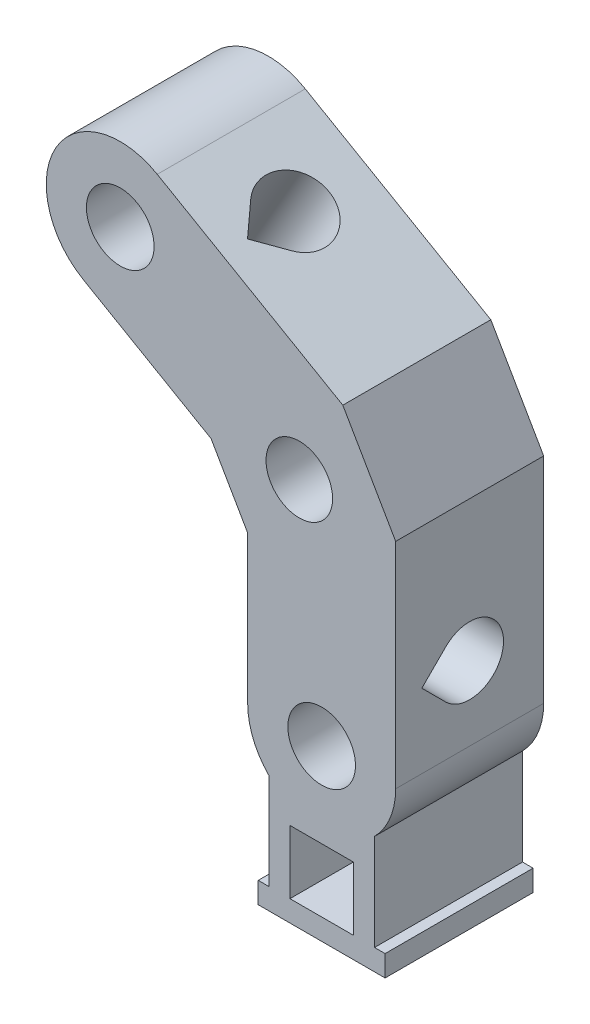
ISO-10303-21;
HEADER;
FILE_DESCRIPTION(('STEP AP214'),'2;1');
FILE_NAME('part.step','',(''),(''),'','','');
FILE_SCHEMA(('AUTOMOTIVE_DESIGN { 1 0 10303 214 1 1 1 1 }'));
ENDSEC;
DATA;
#1=APPLICATION_CONTEXT('core data for automotive mechanical design processes');
#2=APPLICATION_PROTOCOL_DEFINITION('international standard','automotive_design',2000,#1);
#3=PRODUCT_CONTEXT('',#1,'mechanical');
#4=PRODUCT('Part','Part','',(#3));
#5=PRODUCT_RELATED_PRODUCT_CATEGORY('part','',(#4));
#6=PRODUCT_DEFINITION_FORMATION('','',#4);
#7=PRODUCT_DEFINITION_CONTEXT('part definition',#1,'design');
#8=PRODUCT_DEFINITION('design','',#6,#7);
#9=PRODUCT_DEFINITION_SHAPE('','',#8);
#10=(LENGTH_UNIT() NAMED_UNIT(*) SI_UNIT(.MILLI.,.METRE.));
#11=(NAMED_UNIT(*) PLANE_ANGLE_UNIT() SI_UNIT($,.RADIAN.));
#12=(NAMED_UNIT(*) SI_UNIT($,.STERADIAN.) SOLID_ANGLE_UNIT());
#13=UNCERTAINTY_MEASURE_WITH_UNIT(LENGTH_MEASURE(1.E-05),#10,'distance_accuracy_value','');
#14=(GEOMETRIC_REPRESENTATION_CONTEXT(3) GLOBAL_UNCERTAINTY_ASSIGNED_CONTEXT((#13)) GLOBAL_UNIT_ASSIGNED_CONTEXT((#10,
#11,#12)) REPRESENTATION_CONTEXT('',''));
#15=CARTESIAN_POINT('',(0.,0.,0.));
#16=DIRECTION('',(0.,0.,1.));
#17=DIRECTION('',(1.,0.,0.));
#18=AXIS2_PLACEMENT_3D('',#15,#16,#17);
#19=CARTESIAN_POINT('',(1.76670744006513E-13,2.35810055605255E-13,0.));
#20=DIRECTION('',(0.,0.,1.));
#21=DIRECTION('',(1.,0.,0.));
#22=AXIS2_PLACEMENT_3D('',#19,#20,#21);
#23=CYLINDRICAL_SURFACE('',#22,7.);
#24=CARTESIAN_POINT('',(1.76670744006513E-13,2.35810055605255E-13,14.));
#25=DIRECTION('',(0.,0.,1.));
#26=DIRECTION('',(1.,0.,0.));
#27=AXIS2_PLACEMENT_3D('',#24,#25,#26);
#28=CIRCLE('',#27,7.);
#29=CARTESIAN_POINT('',(5.00000000000018,-4.89897948556613,14.));
#30=VERTEX_POINT('',#29);
#31=CARTESIAN_POINT('',(7.00000000000018,2.35810055605255E-13,14.));
#32=VERTEX_POINT('',#31);
#33=EDGE_CURVE('E288',#30,#32,#28,.T.);
#34=ORIENTED_EDGE('',*,*,#33,.F.);
#35=DIRECTION('',(0.,0.,1.));
#36=VECTOR('',#35,1.);
#37=CARTESIAN_POINT('',(5.00000000000018,-4.89897948556613,0.));
#38=LINE('',#37,#36);
#39=CARTESIAN_POINT('',(5.00000000000018,-4.89897948556613,0.));
#40=VERTEX_POINT('',#39);
#41=EDGE_CURVE('E391',#40,#30,#38,.T.);
#42=ORIENTED_EDGE('',*,*,#41,.F.);
#43=CARTESIAN_POINT('',(1.76670744006513E-13,2.35810055605255E-13,0.));
#44=DIRECTION('',(0.,0.,1.));
#45=DIRECTION('',(1.,0.,0.));
#46=AXIS2_PLACEMENT_3D('',#43,#44,#45);
#47=CIRCLE('',#46,7.);
#48=CARTESIAN_POINT('',(7.00000000000018,2.35810055605255E-13,0.));
#49=VERTEX_POINT('',#48);
#50=EDGE_CURVE('E295',#40,#49,#47,.T.);
#51=ORIENTED_EDGE('',*,*,#50,.T.);
#52=DIRECTION('',(0.,0.,1.));
#53=VECTOR('',#52,1.);
#54=CARTESIAN_POINT('',(7.00000000000018,2.35810055605255E-13,0.));
#55=LINE('',#54,#53);
#56=EDGE_CURVE('E344',#49,#32,#55,.T.);
#57=ORIENTED_EDGE('',*,*,#56,.T.);
#58=EDGE_LOOP('',(#34,#42,#51,#57));
#59=FACE_BOUND('',#58,.T.);
#60=ADVANCED_FACE('F34',(#59),#23,.T.);
#61=CARTESIAN_POINT('',(5.00000000000018,-13.9999999999998,0.));
#62=DIRECTION('',(1.,0.,0.));
#63=DIRECTION('',(0.,0.,-1.));
#64=AXIS2_PLACEMENT_3D('',#61,#62,#63);
#65=PLANE('',#64);
#66=DIRECTION('',(0.,1.,0.));
#67=VECTOR('',#66,1.);
#68=CARTESIAN_POINT('',(5.00000000000018,-13.9999999999998,14.));
#69=LINE('',#68,#67);
#70=CARTESIAN_POINT('',(5.00000000000018,-13.9999999999998,14.));
#71=VERTEX_POINT('',#70);
#72=EDGE_CURVE('E299',#71,#30,#69,.T.);
#73=ORIENTED_EDGE('',*,*,#72,.F.);
#74=DIRECTION('',(0.,0.,1.));
#75=VECTOR('',#74,1.);
#76=CARTESIAN_POINT('',(5.00000000000018,-13.9999999999998,0.));
#77=LINE('',#76,#75);
#78=CARTESIAN_POINT('',(5.00000000000018,-13.9999999999998,0.));
#79=VERTEX_POINT('',#78);
#80=EDGE_CURVE('E394',#79,#71,#77,.T.);
#81=ORIENTED_EDGE('',*,*,#80,.F.);
#82=DIRECTION('',(0.,1.,0.));
#83=VECTOR('',#82,1.);
#84=CARTESIAN_POINT('',(5.00000000000018,-13.9999999999998,0.));
#85=LINE('',#84,#83);
#86=EDGE_CURVE('E341',#79,#40,#85,.T.);
#87=ORIENTED_EDGE('',*,*,#86,.T.);
#88=ORIENTED_EDGE('',*,*,#41,.T.);
#89=EDGE_LOOP('',(#73,#81,#87,#88));
#90=FACE_BOUND('',#89,.T.);
#91=ADVANCED_FACE('F454',(#90),#65,.T.);
#92=CARTESIAN_POINT('',(5.00000000000018,-13.9999999999998,0.));
#93=DIRECTION('',(0.,1.,0.));
#94=DIRECTION('',(0.,0.,1.));
#95=AXIS2_PLACEMENT_3D('',#92,#93,#94);
#96=PLANE('',#95);
#97=DIRECTION('',(-1.,0.,0.));
#98=VECTOR('',#97,1.);
#99=CARTESIAN_POINT('',(5.00000000000018,-13.9999999999998,14.));
#100=LINE('',#99,#98);
#101=CARTESIAN_POINT('',(6.00000000000018,-13.9999999999998,14.));
#102=VERTEX_POINT('',#101);
#103=EDGE_CURVE('E386',#102,#71,#100,.T.);
#104=ORIENTED_EDGE('',*,*,#103,.F.);
#105=DIRECTION('',(0.,0.,1.));
#106=VECTOR('',#105,1.);
#107=CARTESIAN_POINT('',(6.00000000000018,-13.9999999999998,0.));
#108=LINE('',#107,#106);
#109=CARTESIAN_POINT('',(6.00000000000018,-13.9999999999998,0.));
#110=VERTEX_POINT('',#109);
#111=EDGE_CURVE('E396',#110,#102,#108,.T.);
#112=ORIENTED_EDGE('',*,*,#111,.F.);
#113=DIRECTION('',(-1.,0.,0.));
#114=VECTOR('',#113,1.);
#115=CARTESIAN_POINT('',(5.00000000000018,-13.9999999999998,0.));
#116=LINE('',#115,#114);
#117=EDGE_CURVE('E338',#110,#79,#116,.T.);
#118=ORIENTED_EDGE('',*,*,#117,.T.);
#119=ORIENTED_EDGE('',*,*,#80,.T.);
#120=EDGE_LOOP('',(#104,#112,#118,#119));
#121=FACE_BOUND('',#120,.T.);
#122=ADVANCED_FACE('F457',(#121),#96,.T.);
#123=CARTESIAN_POINT('',(6.00000000000018,-13.9999999999998,0.));
#124=DIRECTION('',(1.,0.,0.));
#125=DIRECTION('',(0.,0.,-1.));
#126=AXIS2_PLACEMENT_3D('',#123,#124,#125);
#127=PLANE('',#126);
#128=DIRECTION('',(0.,1.,0.));
#129=VECTOR('',#128,1.);
#130=CARTESIAN_POINT('',(6.00000000000018,-13.9999999999998,14.));
#131=LINE('',#130,#129);
#132=CARTESIAN_POINT('',(6.00000000000018,-15.9999999999998,14.));
#133=VERTEX_POINT('',#132);
#134=EDGE_CURVE('E383',#133,#102,#131,.T.);
#135=ORIENTED_EDGE('',*,*,#134,.F.);
#136=DIRECTION('',(0.,0.,1.));
#137=VECTOR('',#136,1.);
#138=CARTESIAN_POINT('',(6.00000000000018,-15.9999999999998,0.));
#139=LINE('',#138,#137);
#140=CARTESIAN_POINT('',(6.00000000000018,-15.9999999999998,0.));
#141=VERTEX_POINT('',#140);
#142=EDGE_CURVE('E398',#141,#133,#139,.T.);
#143=ORIENTED_EDGE('',*,*,#142,.F.);
#144=DIRECTION('',(0.,1.,0.));
#145=VECTOR('',#144,1.);
#146=CARTESIAN_POINT('',(6.00000000000018,-13.9999999999998,0.));
#147=LINE('',#146,#145);
#148=EDGE_CURVE('E335',#141,#110,#147,.T.);
#149=ORIENTED_EDGE('',*,*,#148,.T.);
#150=ORIENTED_EDGE('',*,*,#111,.T.);
#151=EDGE_LOOP('',(#135,#143,#149,#150));
#152=FACE_BOUND('',#151,.T.);
#153=ADVANCED_FACE('F462',(#152),#127,.T.);
#154=CARTESIAN_POINT('',(-5.99999999999982,-15.9999999999998,0.));
#155=DIRECTION('',(0.,-1.,0.));
#156=DIRECTION('',(0.,0.,-1.));
#157=AXIS2_PLACEMENT_3D('',#154,#155,#156);
#158=PLANE('',#157);
#159=DIRECTION('',(1.,0.,0.));
#160=VECTOR('',#159,1.);
#161=CARTESIAN_POINT('',(-5.99999999999982,-15.9999999999998,14.));
#162=LINE('',#161,#160);
#163=CARTESIAN_POINT('',(-5.99999999999982,-15.9999999999998,14.));
#164=VERTEX_POINT('',#163);
#165=EDGE_CURVE('E380',#164,#133,#162,.T.);
#166=ORIENTED_EDGE('',*,*,#165,.F.);
#167=DIRECTION('',(0.,0.,1.));
#168=VECTOR('',#167,1.);
#169=CARTESIAN_POINT('',(-5.99999999999982,-15.9999999999998,0.));
#170=LINE('',#169,#168);
#171=CARTESIAN_POINT('',(-5.99999999999982,-15.9999999999998,0.));
#172=VERTEX_POINT('',#171);
#173=EDGE_CURVE('E400',#172,#164,#170,.T.);
#174=ORIENTED_EDGE('',*,*,#173,.F.);
#175=DIRECTION('',(1.,0.,0.));
#176=VECTOR('',#175,1.);
#177=CARTESIAN_POINT('',(-5.99999999999982,-15.9999999999998,0.));
#178=LINE('',#177,#176);
#179=EDGE_CURVE('E332',#172,#141,#178,.T.);
#180=ORIENTED_EDGE('',*,*,#179,.T.);
#181=ORIENTED_EDGE('',*,*,#142,.T.);
#182=EDGE_LOOP('',(#166,#174,#180,#181));
#183=FACE_BOUND('',#182,.T.);
#184=ADVANCED_FACE('F465',(#183),#158,.T.);
#185=CARTESIAN_POINT('',(-5.99999999999982,-13.9999999999998,0.));
#186=DIRECTION('',(-1.,0.,0.));
#187=DIRECTION('',(0.,0.,1.));
#188=AXIS2_PLACEMENT_3D('',#185,#186,#187);
#189=PLANE('',#188);
#190=DIRECTION('',(0.,-1.,0.));
#191=VECTOR('',#190,1.);
#192=CARTESIAN_POINT('',(-5.99999999999982,-13.9999999999998,14.));
#193=LINE('',#192,#191);
#194=CARTESIAN_POINT('',(-5.99999999999982,-13.9999999999998,14.));
#195=VERTEX_POINT('',#194);
#196=EDGE_CURVE('E377',#195,#164,#193,.T.);
#197=ORIENTED_EDGE('',*,*,#196,.F.);
#198=DIRECTION('',(0.,0.,1.));
#199=VECTOR('',#198,1.);
#200=CARTESIAN_POINT('',(-5.99999999999982,-13.9999999999998,0.));
#201=LINE('',#200,#199);
#202=CARTESIAN_POINT('',(-5.99999999999982,-13.9999999999998,0.));
#203=VERTEX_POINT('',#202);
#204=EDGE_CURVE('E402',#203,#195,#201,.T.);
#205=ORIENTED_EDGE('',*,*,#204,.F.);
#206=DIRECTION('',(0.,-1.,0.));
#207=VECTOR('',#206,1.);
#208=CARTESIAN_POINT('',(-5.99999999999982,-13.9999999999998,0.));
#209=LINE('',#208,#207);
#210=EDGE_CURVE('E329',#203,#172,#209,.T.);
#211=ORIENTED_EDGE('',*,*,#210,.T.);
#212=ORIENTED_EDGE('',*,*,#173,.T.);
#213=EDGE_LOOP('',(#197,#205,#211,#212));
#214=FACE_BOUND('',#213,.T.);
#215=ADVANCED_FACE('F470',(#214),#189,.T.);
#216=CARTESIAN_POINT('',(-5.99999999999982,-13.9999999999998,0.));
#217=DIRECTION('',(0.,1.,0.));
#218=DIRECTION('',(-1.,0.,0.));
#219=AXIS2_PLACEMENT_3D('',#216,#217,#218);
#220=PLANE('',#219);
#221=DIRECTION('',(-1.,0.,0.));
#222=VECTOR('',#221,1.);
#223=CARTESIAN_POINT('',(-5.99999999999982,-13.9999999999998,14.));
#224=LINE('',#223,#222);
#225=CARTESIAN_POINT('',(-4.99999999999982,-13.9999999999998,14.));
#226=VERTEX_POINT('',#225);
#227=EDGE_CURVE('E374',#226,#195,#224,.T.);
#228=ORIENTED_EDGE('',*,*,#227,.F.);
#229=DIRECTION('',(0.,0.,1.));
#230=VECTOR('',#229,1.);
#231=CARTESIAN_POINT('',(-4.99999999999982,-13.9999999999998,0.));
#232=LINE('',#231,#230);
#233=CARTESIAN_POINT('',(-4.99999999999982,-13.9999999999998,0.));
#234=VERTEX_POINT('',#233);
#235=EDGE_CURVE('E404',#234,#226,#232,.T.);
#236=ORIENTED_EDGE('',*,*,#235,.F.);
#237=DIRECTION('',(-1.,0.,0.));
#238=VECTOR('',#237,1.);
#239=CARTESIAN_POINT('',(-5.99999999999982,-13.9999999999998,0.));
#240=LINE('',#239,#238);
#241=EDGE_CURVE('E326',#234,#203,#240,.T.);
#242=ORIENTED_EDGE('',*,*,#241,.T.);
#243=ORIENTED_EDGE('',*,*,#204,.T.);
#244=EDGE_LOOP('',(#228,#236,#242,#243));
#245=FACE_BOUND('',#244,.T.);
#246=ADVANCED_FACE('F473',(#245),#220,.T.);
#247=CARTESIAN_POINT('',(-4.99999999999982,-13.9999999999998,0.));
#248=DIRECTION('',(-1.,0.,0.));
#249=DIRECTION('',(0.,0.,1.));
#250=AXIS2_PLACEMENT_3D('',#247,#248,#249);
#251=PLANE('',#250);
#252=DIRECTION('',(0.,-1.,0.));
#253=VECTOR('',#252,1.);
#254=CARTESIAN_POINT('',(-4.99999999999982,-13.9999999999998,14.));
#255=LINE('',#254,#253);
#256=CARTESIAN_POINT('',(-4.99999999999982,-4.89897948556613,14.));
#257=VERTEX_POINT('',#256);
#258=EDGE_CURVE('E371',#257,#226,#255,.T.);
#259=ORIENTED_EDGE('',*,*,#258,.F.);
#260=DIRECTION('',(0.,0.,1.));
#261=VECTOR('',#260,1.);
#262=CARTESIAN_POINT('',(-4.99999999999982,-4.89897948556613,0.));
#263=LINE('',#262,#261);
#264=CARTESIAN_POINT('',(-4.99999999999982,-4.89897948556613,0.));
#265=VERTEX_POINT('',#264);
#266=EDGE_CURVE('E406',#265,#257,#263,.T.);
#267=ORIENTED_EDGE('',*,*,#266,.F.);
#268=DIRECTION('',(0.,-1.,0.));
#269=VECTOR('',#268,1.);
#270=CARTESIAN_POINT('',(-4.99999999999982,-13.9999999999998,0.));
#271=LINE('',#270,#269);
#272=EDGE_CURVE('E323',#265,#234,#271,.T.);
#273=ORIENTED_EDGE('',*,*,#272,.T.);
#274=ORIENTED_EDGE('',*,*,#235,.T.);
#275=EDGE_LOOP('',(#259,#267,#273,#274));
#276=FACE_BOUND('',#275,.T.);
#277=ADVANCED_FACE('F478',(#276),#251,.T.);
#278=CARTESIAN_POINT('',(1.76670744006513E-13,2.35810055605255E-13,0.));
#279=DIRECTION('',(0.,0.,1.));
#280=DIRECTION('',(1.,0.,0.));
#281=AXIS2_PLACEMENT_3D('',#278,#279,#280);
#282=CYLINDRICAL_SURFACE('',#281,7.);
#283=CARTESIAN_POINT('',(1.76670744006513E-13,2.35810055605255E-13,14.));
#284=DIRECTION('',(0.,0.,1.));
#285=DIRECTION('',(1.,0.,0.));
#286=AXIS2_PLACEMENT_3D('',#283,#284,#285);
#287=CIRCLE('',#286,7.);
#288=CARTESIAN_POINT('',(-6.99999999999982,2.35810055605255E-13,14.));
#289=VERTEX_POINT('',#288);
#290=EDGE_CURVE('E368',#289,#257,#287,.T.);
#291=ORIENTED_EDGE('',*,*,#290,.F.);
#292=DIRECTION('',(0.,0.,1.));
#293=VECTOR('',#292,1.);
#294=CARTESIAN_POINT('',(-6.99999999999982,2.35810055605255E-13,0.));
#295=LINE('',#294,#293);
#296=CARTESIAN_POINT('',(-6.99999999999982,2.35810055605255E-13,0.));
#297=VERTEX_POINT('',#296);
#298=EDGE_CURVE('E408',#297,#289,#295,.T.);
#299=ORIENTED_EDGE('',*,*,#298,.F.);
#300=CARTESIAN_POINT('',(1.76670744006513E-13,2.35810055605255E-13,0.));
#301=DIRECTION('',(0.,0.,1.));
#302=DIRECTION('',(1.,0.,0.));
#303=AXIS2_PLACEMENT_3D('',#300,#301,#302);
#304=CIRCLE('',#303,7.);
#305=EDGE_CURVE('E320',#297,#265,#304,.T.);
#306=ORIENTED_EDGE('',*,*,#305,.T.);
#307=ORIENTED_EDGE('',*,*,#266,.T.);
#308=EDGE_LOOP('',(#291,#299,#306,#307));
#309=FACE_BOUND('',#308,.T.);
#310=ADVANCED_FACE('F481',(#309),#282,.T.);
#311=CARTESIAN_POINT('',(-6.9999999999999,13.9585481156721,0.));
#312=DIRECTION('',(-1.,0.,0.));
#313=DIRECTION('',(0.,-1.,0.));
#314=AXIS2_PLACEMENT_3D('',#311,#312,#313);
#315=PLANE('',#314);
#316=CARTESIAN_POINT('',(-6.99999999999982,6.99999999999971,7.));
#317=DIRECTION('',(-1.,0.,0.));
#318=DIRECTION('',(0.,-1.,0.));
#319=AXIS2_PLACEMENT_3D('',#316,#317,#318);
#320=CIRCLE('',#319,3.2);
#321=CARTESIAN_POINT('',(-6.99999999999982,9.26274169979667,9.26274169979694));
#322=VERTEX_POINT('',#321);
#323=CARTESIAN_POINT('',(-6.99999999999985,4.73725830020277,9.26274169979697));
#324=VERTEX_POINT('',#323);
#325=EDGE_CURVE('E225',#322,#324,#320,.T.);
#326=ORIENTED_EDGE('',*,*,#325,.F.);
#327=DIRECTION('',(0.,0.707106781186543,-0.707106781186552));
#328=VECTOR('',#327,1.);
#329=CARTESIAN_POINT('',(-6.99999999999982,6.99999999999973,11.5254833995939));
#330=LINE('',#329,#328);
#331=CARTESIAN_POINT('',(-6.99999999999982,6.99999999999973,11.5254833995939));
#332=VERTEX_POINT('',#331);
#333=EDGE_CURVE('E231',#332,#322,#330,.T.);
#334=ORIENTED_EDGE('',*,*,#333,.F.);
#335=DIRECTION('',(0.,0.707106781186551,0.707106781186544));
#336=VECTOR('',#335,1.);
#337=CARTESIAN_POINT('',(-6.99999999999982,4.73725830020277,9.26274169979697));
#338=LINE('',#337,#336);
#339=EDGE_CURVE('E239',#324,#332,#338,.T.);
#340=ORIENTED_EDGE('',*,*,#339,.F.);
#341=EDGE_LOOP('',(#326,#334,#340));
#342=FACE_BOUND('',#341,.T.);
#343=DIRECTION('',(0.,-1.,0.));
#344=VECTOR('',#343,1.);
#345=CARTESIAN_POINT('',(-6.9999999999999,13.9585481156721,14.));
#346=LINE('',#345,#344);
#347=CARTESIAN_POINT('',(-6.9999999999999,13.9585481156721,14.));
#348=VERTEX_POINT('',#347);
#349=EDGE_CURVE('E365',#348,#289,#346,.T.);
#350=ORIENTED_EDGE('',*,*,#349,.F.);
#351=DIRECTION('',(0.,0.,1.));
#352=VECTOR('',#351,1.);
#353=CARTESIAN_POINT('',(-6.9999999999999,13.9585481156721,0.));
#354=LINE('',#353,#352);
#355=CARTESIAN_POINT('',(-6.9999999999999,13.9585481156721,0.));
#356=VERTEX_POINT('',#355);
#357=EDGE_CURVE('E410',#356,#348,#354,.T.);
#358=ORIENTED_EDGE('',*,*,#357,.F.);
#359=DIRECTION('',(0.,-1.,0.));
#360=VECTOR('',#359,1.);
#361=CARTESIAN_POINT('',(-6.9999999999999,13.9585481156721,0.));
#362=LINE('',#361,#360);
#363=EDGE_CURVE('E317',#356,#297,#362,.T.);
#364=ORIENTED_EDGE('',*,*,#363,.T.);
#365=ORIENTED_EDGE('',*,*,#298,.T.);
#366=EDGE_LOOP('',(#350,#358,#364,#365));
#367=FACE_BOUND('',#366,.T.);
#368=ADVANCED_FACE('F486',(#342,#367),#315,.T.);
#369=CARTESIAN_POINT('',(-10.4641016151382,19.9585481156731,0.));
#370=DIRECTION('',(-0.866025403784438,-0.5,0.));
#371=DIRECTION('',(0.5,-0.866025403784439,0.));
#372=AXIS2_PLACEMENT_3D('',#369,#370,#371);
#373=PLANE('',#372);
#374=DIRECTION('',(0.5,-0.866025403784438,0.));
#375=VECTOR('',#374,1.);
#376=CARTESIAN_POINT('',(-10.4641016151382,19.9585481156731,14.));
#377=LINE('',#376,#375);
#378=CARTESIAN_POINT('',(-10.4641016151382,19.9585481156731,14.));
#379=VERTEX_POINT('',#378);
#380=EDGE_CURVE('E362',#379,#348,#377,.T.);
#381=ORIENTED_EDGE('',*,*,#380,.F.);
#382=DIRECTION('',(0.,0.,1.));
#383=VECTOR('',#382,1.);
#384=CARTESIAN_POINT('',(-10.4641016151382,19.9585481156731,0.));
#385=LINE('',#384,#383);
#386=CARTESIAN_POINT('',(-10.4641016151382,19.9585481156731,0.));
#387=VERTEX_POINT('',#386);
#388=EDGE_CURVE('E412',#387,#379,#385,.T.);
#389=ORIENTED_EDGE('',*,*,#388,.F.);
#390=DIRECTION('',(0.5,-0.866025403784438,0.));
#391=VECTOR('',#390,1.);
#392=CARTESIAN_POINT('',(-10.4641016151382,19.9585481156731,0.));
#393=LINE('',#392,#391);
#394=EDGE_CURVE('E314',#387,#356,#393,.T.);
#395=ORIENTED_EDGE('',*,*,#394,.T.);
#396=ORIENTED_EDGE('',*,*,#357,.T.);
#397=EDGE_LOOP('',(#381,#389,#395,#396));
#398=FACE_BOUND('',#397,.T.);
#399=ADVANCED_FACE('F489',(#398),#373,.T.);
#400=CARTESIAN_POINT('',(-22.5525588832574,26.9378221735091,0.));
#401=DIRECTION('',(-0.500000000000008,-0.866025403784434,0.));
#402=DIRECTION('',(0.866025403784434,-0.500000000000008,0.));
#403=AXIS2_PLACEMENT_3D('',#400,#401,#402);
#404=PLANE('',#403);
#405=DIRECTION('',(-0.612372435695793,0.353553390593272,0.707106781186549));
#406=VECTOR('',#405,1.);
#407=CARTESIAN_POINT('',(-14.5307009376536,22.3064003292134,9.26274169979695));
#408=LINE('',#407,#406);
#409=CARTESIAN_POINT('',(-14.5307009376536,22.3064003292134,9.26274169979695));
#410=VERTEX_POINT('',#409);
#411=CARTESIAN_POINT('',(-16.49029273188,23.4377711791121,11.5254833995939));
#412=VERTEX_POINT('',#411);
#413=EDGE_CURVE('E48',#410,#412,#408,.T.);
#414=ORIENTED_EDGE('',*,*,#413,.F.);
#415=CARTESIAN_POINT('',(-16.4902927318801,23.4377711791119,7.));
#416=DIRECTION('',(-0.499999999999998,-0.86602540378444,0.));
#417=DIRECTION('',(0.86602540378444,-0.499999999999998,0.));
#418=AXIS2_PLACEMENT_3D('',#415,#416,#417);
#419=CIRCLE('',#418,3.2);
#420=CARTESIAN_POINT('',(-18.4498845261067,24.5691420290104,9.26274169979695));
#421=VERTEX_POINT('',#420);
#422=EDGE_CURVE('E208',#421,#410,#419,.T.);
#423=ORIENTED_EDGE('',*,*,#422,.F.);
#424=DIRECTION('',(-0.612372435695796,0.353553390593272,-0.707106781186547));
#425=VECTOR('',#424,1.);
#426=CARTESIAN_POINT('',(-16.4902927318801,23.4377711791119,11.5254833995939));
#427=LINE('',#426,#425);
#428=EDGE_CURVE('E215',#412,#421,#427,.T.);
#429=ORIENTED_EDGE('',*,*,#428,.F.);
#430=EDGE_LOOP('',(#414,#423,#429));
#431=FACE_BOUND('',#430,.T.);
#432=DIRECTION('',(0.866025403784434,-0.500000000000008,0.));
#433=VECTOR('',#432,1.);
#434=CARTESIAN_POINT('',(-22.5525588832574,26.9378221735091,14.));
#435=LINE('',#434,#433);
#436=CARTESIAN_POINT('',(-22.5525588832574,26.9378221735091,14.));
#437=VERTEX_POINT('',#436);
#438=EDGE_CURVE('E359',#437,#379,#435,.T.);
#439=ORIENTED_EDGE('',*,*,#438,.F.);
#440=DIRECTION('',(0.,0.,1.));
#441=VECTOR('',#440,1.);
#442=CARTESIAN_POINT('',(-22.5525588832574,26.9378221735091,0.));
#443=LINE('',#442,#441);
#444=CARTESIAN_POINT('',(-22.5525588832574,26.9378221735091,0.));
#445=VERTEX_POINT('',#444);
#446=EDGE_CURVE('E414',#445,#437,#443,.T.);
#447=ORIENTED_EDGE('',*,*,#446,.F.);
#448=DIRECTION('',(0.866025403784434,-0.500000000000008,0.));
#449=VECTOR('',#448,1.);
#450=CARTESIAN_POINT('',(-22.5525588832574,26.9378221735091,0.));
#451=LINE('',#450,#449);
#452=EDGE_CURVE('E311',#445,#387,#451,.T.);
#453=ORIENTED_EDGE('',*,*,#452,.T.);
#454=ORIENTED_EDGE('',*,*,#388,.T.);
#455=EDGE_LOOP('',(#439,#447,#453,#454));
#456=FACE_BOUND('',#455,.T.);
#457=ADVANCED_FACE('F219',(#431,#456),#404,.T.);
#458=CARTESIAN_POINT('',(-19.0525588832574,33.0000000000002,0.));
#459=DIRECTION('',(0.,0.,1.));
#460=DIRECTION('',(1.,0.,0.));
#461=AXIS2_PLACEMENT_3D('',#458,#459,#460);
#462=CYLINDRICAL_SURFACE('',#461,7.00000000000001);
#463=CARTESIAN_POINT('',(-19.0525588832574,33.0000000000002,14.));
#464=DIRECTION('',(0.,0.,1.));
#465=DIRECTION('',(1.,0.,0.));
#466=AXIS2_PLACEMENT_3D('',#463,#464,#465);
#467=CIRCLE('',#466,7.00000000000001);
#468=CARTESIAN_POINT('',(-15.5525588832575,39.0621778264913,14.));
#469=VERTEX_POINT('',#468);
#470=EDGE_CURVE('E356',#469,#437,#467,.T.);
#471=ORIENTED_EDGE('',*,*,#470,.F.);
#472=DIRECTION('',(0.,0.,1.));
#473=VECTOR('',#472,1.);
#474=CARTESIAN_POINT('',(-15.5525588832575,39.0621778264913,0.));
#475=LINE('',#474,#473);
#476=CARTESIAN_POINT('',(-15.5525588832575,39.0621778264913,0.));
#477=VERTEX_POINT('',#476);
#478=EDGE_CURVE('E416',#477,#469,#475,.T.);
#479=ORIENTED_EDGE('',*,*,#478,.F.);
#480=CARTESIAN_POINT('',(-19.0525588832574,33.0000000000002,0.));
#481=DIRECTION('',(0.,0.,1.));
#482=DIRECTION('',(1.,0.,0.));
#483=AXIS2_PLACEMENT_3D('',#480,#481,#482);
#484=CIRCLE('',#483,7.00000000000001);
#485=EDGE_CURVE('E308',#477,#445,#484,.T.);
#486=ORIENTED_EDGE('',*,*,#485,.T.);
#487=ORIENTED_EDGE('',*,*,#446,.T.);
#488=EDGE_LOOP('',(#471,#479,#486,#487));
#489=FACE_BOUND('',#488,.T.);
#490=ADVANCED_FACE('F430',(#489),#462,.T.);
#491=CARTESIAN_POINT('',(2.00000000000025,28.9282032302758,0.));
#492=DIRECTION('',(0.499999999999997,0.866025403784441,0.));
#493=DIRECTION('',(-0.866025403784441,0.499999999999997,0.));
#494=AXIS2_PLACEMENT_3D('',#491,#492,#493);
#495=PLANE('',#494);
#496=DIRECTION('',(0.612372435695794,-0.353553390593271,-0.707106781186549));
#497=VECTOR('',#496,1.);
#498=CARTESIAN_POINT('',(1.24553434153221,29.3637941812867,-0.871181902021696));
#499=LINE('',#498,#497);
#500=CARTESIAN_POINT('',(-9.49029273187996,35.5621268320944,11.5254833995939));
#501=VERTEX_POINT('',#500);
#502=CARTESIAN_POINT('',(-7.53070093765342,34.4307559821959,9.26274169979695));
#503=VERTEX_POINT('',#502);
#504=EDGE_CURVE('E11',#501,#503,#499,.T.);
#505=ORIENTED_EDGE('',*,*,#504,.F.);
#506=DIRECTION('',(0.612372435695796,-0.353553390593272,0.707106781186547));
#507=VECTOR('',#506,1.);
#508=CARTESIAN_POINT('',(-8.73582707341194,35.1265358810836,12.3966653016156));
#509=LINE('',#508,#507);
#510=CARTESIAN_POINT('',(-11.4498845261065,36.6934976819929,9.26274169979695));
#511=VERTEX_POINT('',#510);
#512=EDGE_CURVE('E393',#511,#501,#509,.T.);
#513=ORIENTED_EDGE('',*,*,#512,.F.);
#514=CARTESIAN_POINT('',(-9.49029273187997,35.5621268320944,7.));
#515=DIRECTION('',(0.499999999999997,0.866025403784441,0.));
#516=DIRECTION('',(-0.866025403784441,0.499999999999997,0.));
#517=AXIS2_PLACEMENT_3D('',#514,#515,#516);
#518=CIRCLE('',#517,3.2);
#519=EDGE_CURVE('E41',#503,#511,#518,.T.);
#520=ORIENTED_EDGE('',*,*,#519,.F.);
#521=EDGE_LOOP('',(#505,#513,#520));
#522=FACE_BOUND('',#521,.T.);
#523=DIRECTION('',(-0.866025403784441,0.499999999999997,0.));
#524=VECTOR('',#523,1.);
#525=CARTESIAN_POINT('',(2.00000000000025,28.9282032302758,14.));
#526=LINE('',#525,#524);
#527=CARTESIAN_POINT('',(2.00000000000025,28.9282032302758,14.));
#528=VERTEX_POINT('',#527);
#529=EDGE_CURVE('E353',#528,#469,#526,.T.);
#530=ORIENTED_EDGE('',*,*,#529,.F.);
#531=DIRECTION('',(0.,0.,1.));
#532=VECTOR('',#531,1.);
#533=CARTESIAN_POINT('',(2.00000000000025,28.9282032302758,0.));
#534=LINE('',#533,#532);
#535=CARTESIAN_POINT('',(2.00000000000025,28.9282032302758,0.));
#536=VERTEX_POINT('',#535);
#537=EDGE_CURVE('E418',#536,#528,#534,.T.);
#538=ORIENTED_EDGE('',*,*,#537,.F.);
#539=DIRECTION('',(-0.866025403784441,0.499999999999997,0.));
#540=VECTOR('',#539,1.);
#541=CARTESIAN_POINT('',(2.00000000000025,28.9282032302758,0.));
#542=LINE('',#541,#540);
#543=EDGE_CURVE('E305',#536,#477,#542,.T.);
#544=ORIENTED_EDGE('',*,*,#543,.T.);
#545=ORIENTED_EDGE('',*,*,#478,.T.);
#546=EDGE_LOOP('',(#530,#538,#544,#545));
#547=FACE_BOUND('',#546,.T.);
#548=ADVANCED_FACE('F426',(#522,#547),#495,.T.);
#549=CARTESIAN_POINT('',(7.00000000000016,20.2679491924314,0.));
#550=DIRECTION('',(0.866025403784444,0.499999999999991,0.));
#551=DIRECTION('',(-0.499999999999991,0.866025403784444,0.));
#552=AXIS2_PLACEMENT_3D('',#549,#550,#551);
#553=PLANE('',#552);
#554=DIRECTION('',(-0.499999999999991,0.866025403784444,0.));
#555=VECTOR('',#554,1.);
#556=CARTESIAN_POINT('',(7.00000000000016,20.2679491924314,14.));
#557=LINE('',#556,#555);
#558=CARTESIAN_POINT('',(7.00000000000016,20.2679491924314,14.));
#559=VERTEX_POINT('',#558);
#560=EDGE_CURVE('E350',#559,#528,#557,.T.);
#561=ORIENTED_EDGE('',*,*,#560,.F.);
#562=DIRECTION('',(0.,0.,1.));
#563=VECTOR('',#562,1.);
#564=CARTESIAN_POINT('',(7.00000000000016,20.2679491924314,0.));
#565=LINE('',#564,#563);
#566=CARTESIAN_POINT('',(7.00000000000016,20.2679491924314,0.));
#567=VERTEX_POINT('',#566);
#568=EDGE_CURVE('E420',#567,#559,#565,.T.);
#569=ORIENTED_EDGE('',*,*,#568,.F.);
#570=DIRECTION('',(-0.499999999999991,0.866025403784444,0.));
#571=VECTOR('',#570,1.);
#572=CARTESIAN_POINT('',(7.00000000000016,20.2679491924314,0.));
#573=LINE('',#572,#571);
#574=EDGE_CURVE('E302',#567,#536,#573,.T.);
#575=ORIENTED_EDGE('',*,*,#574,.T.);
#576=ORIENTED_EDGE('',*,*,#537,.T.);
#577=EDGE_LOOP('',(#561,#569,#575,#576));
#578=FACE_BOUND('',#577,.T.);
#579=ADVANCED_FACE('F429',(#578),#553,.T.);
#580=CARTESIAN_POINT('',(7.00000000000018,2.35810055605255E-13,0.));
#581=DIRECTION('',(1.,0.,0.));
#582=DIRECTION('',(0.,1.,0.));
#583=AXIS2_PLACEMENT_3D('',#580,#581,#582);
#584=PLANE('',#583);
#585=CARTESIAN_POINT('',(7.00000000000018,6.99999999999971,7.));
#586=DIRECTION('',(-1.,0.,0.));
#587=DIRECTION('',(0.,-1.,0.));
#588=AXIS2_PLACEMENT_3D('',#585,#586,#587);
#589=CIRCLE('',#588,3.2);
#590=CARTESIAN_POINT('',(7.00000000000018,9.26274169979667,9.26274169979694));
#591=VERTEX_POINT('',#590);
#592=CARTESIAN_POINT('',(7.00000000000018,4.73725830020277,9.26274169979697));
#593=VERTEX_POINT('',#592);
#594=EDGE_CURVE('E227',#591,#593,#589,.T.);
#595=ORIENTED_EDGE('',*,*,#594,.T.);
#596=DIRECTION('',(0.,0.707106781186551,0.707106781186544));
#597=VECTOR('',#596,1.);
#598=CARTESIAN_POINT('',(7.00000000000018,4.73725830020277,9.26274169979697));
#599=LINE('',#598,#597);
#600=CARTESIAN_POINT('',(7.00000000000017,6.99999999999973,11.5254833995939));
#601=VERTEX_POINT('',#600);
#602=EDGE_CURVE('E230',#593,#601,#599,.T.);
#603=ORIENTED_EDGE('',*,*,#602,.T.);
#604=DIRECTION('',(0.,0.707106781186543,-0.707106781186552));
#605=VECTOR('',#604,1.);
#606=CARTESIAN_POINT('',(7.00000000000018,6.99999999999973,11.5254833995939));
#607=LINE('',#606,#605);
#608=EDGE_CURVE('E234',#601,#591,#607,.T.);
#609=ORIENTED_EDGE('',*,*,#608,.T.);
#610=EDGE_LOOP('',(#595,#603,#609));
#611=FACE_BOUND('',#610,.T.);
#612=DIRECTION('',(0.,1.,0.));
#613=VECTOR('',#612,1.);
#614=CARTESIAN_POINT('',(7.00000000000018,2.35810055605255E-13,14.));
#615=LINE('',#614,#613);
#616=EDGE_CURVE('E347',#32,#559,#615,.T.);
#617=ORIENTED_EDGE('',*,*,#616,.F.);
#618=ORIENTED_EDGE('',*,*,#56,.F.);
#619=DIRECTION('',(0.,1.,0.));
#620=VECTOR('',#619,1.);
#621=CARTESIAN_POINT('',(7.00000000000018,2.35810055605255E-13,0.));
#622=LINE('',#621,#620);
#623=EDGE_CURVE('E298',#49,#567,#622,.T.);
#624=ORIENTED_EDGE('',*,*,#623,.T.);
#625=ORIENTED_EDGE('',*,*,#568,.T.);
#626=EDGE_LOOP('',(#617,#618,#624,#625));
#627=FACE_BOUND('',#626,.T.);
#628=ADVANCED_FACE('F447',(#611,#627),#584,.T.);
#629=CARTESIAN_POINT('',(1.76670744006513E-13,2.35810055605255E-13,0.));
#630=DIRECTION('',(0.,0.,1.));
#631=DIRECTION('',(1.,0.,0.));
#632=AXIS2_PLACEMENT_3D('',#629,#630,#631);
#633=PLANE('',#632);
#634=CARTESIAN_POINT('',(-2.11602540378443,20.7783121635131,0.));
#635=DIRECTION('',(0.,0.,1.));
#636=DIRECTION('',(1.,0.,0.));
#637=AXIS2_PLACEMENT_3D('',#634,#635,#636);
#638=CIRCLE('',#637,3.15);
#639=CARTESIAN_POINT('',(1.03397459621557,20.7783121635131,0.));
#640=VERTEX_POINT('',#639);
#641=EDGE_CURVE('E790',#640,#640,#638,.T.);
#642=ORIENTED_EDGE('',*,*,#641,.T.);
#643=EDGE_LOOP('',(#642));
#644=FACE_BOUND('',#643,.T.);
#645=CARTESIAN_POINT('',(0.,0.,0.));
#646=DIRECTION('',(0.,0.,-1.));
#647=DIRECTION('',(-1.,0.,0.));
#648=AXIS2_PLACEMENT_3D('',#645,#646,#647);
#649=CIRCLE('',#648,3.20000000000001);
#650=CARTESIAN_POINT('',(-3.20000000000001,0.,0.));
#651=VERTEX_POINT('',#650);
#652=EDGE_CURVE('E246',#651,#651,#649,.T.);
#653=ORIENTED_EDGE('',*,*,#652,.F.);
#654=EDGE_LOOP('',(#653));
#655=FACE_BOUND('',#654,.T.);
#656=CARTESIAN_POINT('',(-19.0525,32.999898011206,0.));
#657=DIRECTION('',(0.,0.,-1.));
#658=DIRECTION('',(-1.,0.,0.));
#659=AXIS2_PLACEMENT_3D('',#656,#657,#658);
#660=CIRCLE('',#659,3.20000000000002);
#661=CARTESIAN_POINT('',(-22.2525000000001,32.999898011206,0.));
#662=VERTEX_POINT('',#661);
#663=EDGE_CURVE('E256',#662,#662,#660,.T.);
#664=ORIENTED_EDGE('',*,*,#663,.F.);
#665=EDGE_LOOP('',(#664));
#666=FACE_BOUND('',#665,.T.);
#667=DIRECTION('',(-1.,0.,0.));
#668=VECTOR('',#667,1.);
#669=CARTESIAN_POINT('',(-2.99999999999982,-7.99999999999976,0.));
#670=LINE('',#669,#668);
#671=CARTESIAN_POINT('',(3.00000000000018,-7.99999999999976,0.));
#672=VERTEX_POINT('',#671);
#673=CARTESIAN_POINT('',(-2.99999999999982,-7.99999999999976,0.));
#674=VERTEX_POINT('',#673);
#675=EDGE_CURVE('E273',#672,#674,#670,.T.);
#676=ORIENTED_EDGE('',*,*,#675,.T.);
#677=DIRECTION('',(0.,-1.,0.));
#678=VECTOR('',#677,1.);
#679=CARTESIAN_POINT('',(-2.99999999999982,-13.9999999999998,0.));
#680=LINE('',#679,#678);
#681=CARTESIAN_POINT('',(-2.99999999999982,-13.9999999999998,0.));
#682=VERTEX_POINT('',#681);
#683=EDGE_CURVE('E263',#674,#682,#680,.T.);
#684=ORIENTED_EDGE('',*,*,#683,.T.);
#685=DIRECTION('',(1.,0.,0.));
#686=VECTOR('',#685,1.);
#687=CARTESIAN_POINT('',(-2.99999999999982,-13.9999999999998,0.));
#688=LINE('',#687,#686);
#689=CARTESIAN_POINT('',(3.00000000000018,-13.9999999999998,0.));
#690=VERTEX_POINT('',#689);
#691=EDGE_CURVE('E266',#682,#690,#688,.T.);
#692=ORIENTED_EDGE('',*,*,#691,.T.);
#693=DIRECTION('',(0.,1.,0.));
#694=VECTOR('',#693,1.);
#695=CARTESIAN_POINT('',(3.00000000000018,-13.9999999999998,0.));
#696=LINE('',#695,#694);
#697=EDGE_CURVE('E270',#690,#672,#696,.T.);
#698=ORIENTED_EDGE('',*,*,#697,.T.);
#699=EDGE_LOOP('',(#676,#684,#692,#698));
#700=FACE_BOUND('',#699,.T.);
#701=ORIENTED_EDGE('',*,*,#50,.F.);
#702=ORIENTED_EDGE('',*,*,#86,.F.);
#703=ORIENTED_EDGE('',*,*,#117,.F.);
#704=ORIENTED_EDGE('',*,*,#148,.F.);
#705=ORIENTED_EDGE('',*,*,#179,.F.);
#706=ORIENTED_EDGE('',*,*,#210,.F.);
#707=ORIENTED_EDGE('',*,*,#241,.F.);
#708=ORIENTED_EDGE('',*,*,#272,.F.);
#709=ORIENTED_EDGE('',*,*,#305,.F.);
#710=ORIENTED_EDGE('',*,*,#363,.F.);
#711=ORIENTED_EDGE('',*,*,#394,.F.);
#712=ORIENTED_EDGE('',*,*,#452,.F.);
#713=ORIENTED_EDGE('',*,*,#485,.F.);
#714=ORIENTED_EDGE('',*,*,#543,.F.);
#715=ORIENTED_EDGE('',*,*,#574,.F.);
#716=ORIENTED_EDGE('',*,*,#623,.F.);
#717=EDGE_LOOP('',(#701,#702,#703,#704,#705,#706,#707,#708,#709,#710,#711,#712,#713,#714,#715,#716));
#718=FACE_BOUND('',#717,.T.);
#719=ADVANCED_FACE('F444',(#644,#655,#666,#700,#718),#633,.F.);
#720=CARTESIAN_POINT('',(1.76670744006513E-13,2.35810055605255E-13,14.));
#721=DIRECTION('',(0.,0.,1.));
#722=DIRECTION('',(1.,0.,0.));
#723=AXIS2_PLACEMENT_3D('',#720,#721,#722);
#724=PLANE('',#723);
#725=CARTESIAN_POINT('',(-2.11602540378443,20.7783121635131,14.));
#726=DIRECTION('',(0.,0.,1.));
#727=DIRECTION('',(1.,0.,0.));
#728=AXIS2_PLACEMENT_3D('',#725,#726,#727);
#729=CIRCLE('',#728,3.15);
#730=CARTESIAN_POINT('',(1.03397459621557,20.7783121635131,14.));
#731=VERTEX_POINT('',#730);
#732=EDGE_CURVE('E793',#731,#731,#729,.T.);
#733=ORIENTED_EDGE('',*,*,#732,.F.);
#734=EDGE_LOOP('',(#733));
#735=FACE_BOUND('',#734,.T.);
#736=CARTESIAN_POINT('',(0.,0.,14.));
#737=DIRECTION('',(0.,0.,-1.));
#738=DIRECTION('',(-1.,0.,0.));
#739=AXIS2_PLACEMENT_3D('',#736,#737,#738);
#740=CIRCLE('',#739,3.20000000000001);
#741=CARTESIAN_POINT('',(-3.20000000000001,0.,14.));
#742=VERTEX_POINT('',#741);
#743=EDGE_CURVE('E253',#742,#742,#740,.T.);
#744=ORIENTED_EDGE('',*,*,#743,.T.);
#745=EDGE_LOOP('',(#744));
#746=FACE_BOUND('',#745,.T.);
#747=CARTESIAN_POINT('',(-19.0525,32.999898011206,14.));
#748=DIRECTION('',(0.,0.,-1.));
#749=DIRECTION('',(-1.,0.,0.));
#750=AXIS2_PLACEMENT_3D('',#747,#748,#749);
#751=CIRCLE('',#750,3.20000000000001);
#752=CARTESIAN_POINT('',(-22.2525,32.999898011206,14.));
#753=VERTEX_POINT('',#752);
#754=EDGE_CURVE('E259',#753,#753,#751,.T.);
#755=ORIENTED_EDGE('',*,*,#754,.T.);
#756=EDGE_LOOP('',(#755));
#757=FACE_BOUND('',#756,.T.);
#758=DIRECTION('',(0.,-1.,0.));
#759=VECTOR('',#758,1.);
#760=CARTESIAN_POINT('',(-2.99999999999982,-13.9999999999998,14.));
#761=LINE('',#760,#759);
#762=CARTESIAN_POINT('',(-2.99999999999982,-7.99999999999976,14.));
#763=VERTEX_POINT('',#762);
#764=CARTESIAN_POINT('',(-2.99999999999982,-13.9999999999998,14.));
#765=VERTEX_POINT('',#764);
#766=EDGE_CURVE('E262',#763,#765,#761,.T.);
#767=ORIENTED_EDGE('',*,*,#766,.F.);
#768=DIRECTION('',(-1.,0.,0.));
#769=VECTOR('',#768,1.);
#770=CARTESIAN_POINT('',(-2.99999999999982,-7.99999999999976,14.));
#771=LINE('',#770,#769);
#772=CARTESIAN_POINT('',(3.00000000000018,-7.99999999999976,14.));
#773=VERTEX_POINT('',#772);
#774=EDGE_CURVE('E267',#773,#763,#771,.T.);
#775=ORIENTED_EDGE('',*,*,#774,.F.);
#776=DIRECTION('',(0.,1.,0.));
#777=VECTOR('',#776,1.);
#778=CARTESIAN_POINT('',(3.00000000000018,-13.9999999999998,14.));
#779=LINE('',#778,#777);
#780=CARTESIAN_POINT('',(3.00000000000018,-13.9999999999998,14.));
#781=VERTEX_POINT('',#780);
#782=EDGE_CURVE('E281',#781,#773,#779,.T.);
#783=ORIENTED_EDGE('',*,*,#782,.F.);
#784=DIRECTION('',(1.,0.,0.));
#785=VECTOR('',#784,1.);
#786=CARTESIAN_POINT('',(-2.99999999999982,-13.9999999999998,14.));
#787=LINE('',#786,#785);
#788=EDGE_CURVE('E278',#765,#781,#787,.T.);
#789=ORIENTED_EDGE('',*,*,#788,.F.);
#790=EDGE_LOOP('',(#767,#775,#783,#789));
#791=FACE_BOUND('',#790,.T.);
#792=ORIENTED_EDGE('',*,*,#33,.T.);
#793=ORIENTED_EDGE('',*,*,#616,.T.);
#794=ORIENTED_EDGE('',*,*,#560,.T.);
#795=ORIENTED_EDGE('',*,*,#529,.T.);
#796=ORIENTED_EDGE('',*,*,#470,.T.);
#797=ORIENTED_EDGE('',*,*,#438,.T.);
#798=ORIENTED_EDGE('',*,*,#380,.T.);
#799=ORIENTED_EDGE('',*,*,#349,.T.);
#800=ORIENTED_EDGE('',*,*,#290,.T.);
#801=ORIENTED_EDGE('',*,*,#258,.T.);
#802=ORIENTED_EDGE('',*,*,#227,.T.);
#803=ORIENTED_EDGE('',*,*,#196,.T.);
#804=ORIENTED_EDGE('',*,*,#165,.T.);
#805=ORIENTED_EDGE('',*,*,#134,.T.);
#806=ORIENTED_EDGE('',*,*,#103,.T.);
#807=ORIENTED_EDGE('',*,*,#72,.T.);
#808=EDGE_LOOP('',(#792,#793,#794,#795,#796,#797,#798,#799,#800,#801,#802,#803,#804,#805,#806,#807));
#809=FACE_BOUND('',#808,.T.);
#810=ADVANCED_FACE('F437',(#735,#746,#757,#791,#809),#724,.T.);
#811=CARTESIAN_POINT('',(-2.99999999999982,-13.9999999999998,0.));
#812=DIRECTION('',(-1.,0.,0.));
#813=DIRECTION('',(0.,-1.,0.));
#814=AXIS2_PLACEMENT_3D('',#811,#812,#813);
#815=PLANE('',#814);
#816=ORIENTED_EDGE('',*,*,#766,.T.);
#817=DIRECTION('',(0.,0.,1.));
#818=VECTOR('',#817,1.);
#819=CARTESIAN_POINT('',(-2.99999999999982,-13.9999999999998,0.));
#820=LINE('',#819,#818);
#821=EDGE_CURVE('E276',#682,#765,#820,.T.);
#822=ORIENTED_EDGE('',*,*,#821,.F.);
#823=ORIENTED_EDGE('',*,*,#683,.F.);
#824=DIRECTION('',(0.,0.,1.));
#825=VECTOR('',#824,1.);
#826=CARTESIAN_POINT('',(-2.99999999999982,-7.99999999999976,0.));
#827=LINE('',#826,#825);
#828=EDGE_CURVE('E286',#674,#763,#827,.T.);
#829=ORIENTED_EDGE('',*,*,#828,.T.);
#830=EDGE_LOOP('',(#816,#822,#823,#829));
#831=FACE_BOUND('',#830,.T.);
#832=ADVANCED_FACE('F597',(#831),#815,.F.);
#833=CARTESIAN_POINT('',(-2.99999999999982,-7.99999999999976,0.));
#834=DIRECTION('',(0.,1.,0.));
#835=DIRECTION('',(0.,0.,1.));
#836=AXIS2_PLACEMENT_3D('',#833,#834,#835);
#837=PLANE('',#836);
#838=ORIENTED_EDGE('',*,*,#774,.T.);
#839=ORIENTED_EDGE('',*,*,#828,.F.);
#840=ORIENTED_EDGE('',*,*,#675,.F.);
#841=DIRECTION('',(0.,0.,1.));
#842=VECTOR('',#841,1.);
#843=CARTESIAN_POINT('',(3.00000000000018,-7.99999999999976,0.));
#844=LINE('',#843,#842);
#845=EDGE_CURVE('E289',#672,#773,#844,.T.);
#846=ORIENTED_EDGE('',*,*,#845,.T.);
#847=EDGE_LOOP('',(#838,#839,#840,#846));
#848=FACE_BOUND('',#847,.T.);
#849=ADVANCED_FACE('F632',(#848),#837,.F.);
#850=CARTESIAN_POINT('',(3.00000000000018,-13.9999999999998,0.));
#851=DIRECTION('',(1.,0.,0.));
#852=DIRECTION('',(0.,1.,0.));
#853=AXIS2_PLACEMENT_3D('',#850,#851,#852);
#854=PLANE('',#853);
#855=ORIENTED_EDGE('',*,*,#782,.T.);
#856=ORIENTED_EDGE('',*,*,#845,.F.);
#857=ORIENTED_EDGE('',*,*,#697,.F.);
#858=DIRECTION('',(0.,0.,1.));
#859=VECTOR('',#858,1.);
#860=CARTESIAN_POINT('',(3.00000000000018,-13.9999999999998,0.));
#861=LINE('',#860,#859);
#862=EDGE_CURVE('E291',#690,#781,#861,.T.);
#863=ORIENTED_EDGE('',*,*,#862,.T.);
#864=EDGE_LOOP('',(#855,#856,#857,#863));
#865=FACE_BOUND('',#864,.T.);
#866=ADVANCED_FACE('F635',(#865),#854,.F.);
#867=CARTESIAN_POINT('',(-2.99999999999982,-13.9999999999998,0.));
#868=DIRECTION('',(0.,-1.,0.));
#869=DIRECTION('',(1.,0.,0.));
#870=AXIS2_PLACEMENT_3D('',#867,#868,#869);
#871=PLANE('',#870);
#872=ORIENTED_EDGE('',*,*,#788,.T.);
#873=ORIENTED_EDGE('',*,*,#862,.F.);
#874=ORIENTED_EDGE('',*,*,#691,.F.);
#875=ORIENTED_EDGE('',*,*,#821,.T.);
#876=EDGE_LOOP('',(#872,#873,#874,#875));
#877=FACE_BOUND('',#876,.T.);
#878=ADVANCED_FACE('F630',(#877),#871,.F.);
#879=CARTESIAN_POINT('',(-19.0525,32.999898011206,0.));
#880=DIRECTION('',(0.,0.,-1.));
#881=DIRECTION('',(-1.,0.,0.));
#882=AXIS2_PLACEMENT_3D('',#879,#880,#881);
#883=CYLINDRICAL_SURFACE('',#882,3.20000000000001);
#884=ORIENTED_EDGE('',*,*,#754,.F.);
#885=EDGE_LOOP('',(#884));
#886=FACE_BOUND('',#885,.T.);
#887=ORIENTED_EDGE('',*,*,#663,.T.);
#888=EDGE_LOOP('',(#887));
#889=FACE_BOUND('',#888,.T.);
#890=ADVANCED_FACE('F626',(#886,#889),#883,.F.);
#891=CARTESIAN_POINT('',(0.,0.,0.));
#892=DIRECTION('',(0.,0.,-1.));
#893=DIRECTION('',(-1.,0.,0.));
#894=AXIS2_PLACEMENT_3D('',#891,#892,#893);
#895=CYLINDRICAL_SURFACE('',#894,3.20000000000001);
#896=ORIENTED_EDGE('',*,*,#743,.F.);
#897=EDGE_LOOP('',(#896));
#898=FACE_BOUND('',#897,.T.);
#899=ORIENTED_EDGE('',*,*,#652,.T.);
#900=EDGE_LOOP('',(#899));
#901=FACE_BOUND('',#900,.T.);
#902=ADVANCED_FACE('F622',(#898,#901),#895,.F.);
#903=CARTESIAN_POINT('',(7.00000000000018,6.99999999999971,7.));
#904=DIRECTION('',(-1.,0.,0.));
#905=DIRECTION('',(0.,-1.,0.));
#906=AXIS2_PLACEMENT_3D('',#903,#904,#905);
#907=CYLINDRICAL_SURFACE('',#906,3.2);
#908=ORIENTED_EDGE('',*,*,#325,.T.);
#909=DIRECTION('',(-1.,0.,0.));
#910=VECTOR('',#909,1.);
#911=CARTESIAN_POINT('',(7.00000000000018,4.73725830020277,9.26274169979697));
#912=LINE('',#911,#910);
#913=EDGE_CURVE('E237',#593,#324,#912,.T.);
#914=ORIENTED_EDGE('',*,*,#913,.F.);
#915=ORIENTED_EDGE('',*,*,#594,.F.);
#916=DIRECTION('',(-1.,0.,0.));
#917=VECTOR('',#916,1.);
#918=CARTESIAN_POINT('',(7.00000000000018,9.26274169979667,9.26274169979694));
#919=LINE('',#918,#917);
#920=EDGE_CURVE('E244',#591,#322,#919,.T.);
#921=ORIENTED_EDGE('',*,*,#920,.T.);
#922=EDGE_LOOP('',(#908,#914,#915,#921));
#923=FACE_BOUND('',#922,.T.);
#924=ADVANCED_FACE('F616',(#923),#907,.F.);
#925=CARTESIAN_POINT('',(7.00000000000018,6.99999999999973,11.5254833995939));
#926=DIRECTION('',(0.,0.707106781186552,0.707106781186543));
#927=DIRECTION('',(0.,-0.707106781186543,0.707106781186552));
#928=AXIS2_PLACEMENT_3D('',#925,#926,#927);
#929=PLANE('',#928);
#930=ORIENTED_EDGE('',*,*,#333,.T.);
#931=ORIENTED_EDGE('',*,*,#920,.F.);
#932=ORIENTED_EDGE('',*,*,#608,.F.);
#933=DIRECTION('',(-1.,0.,0.));
#934=VECTOR('',#933,1.);
#935=CARTESIAN_POINT('',(7.00000000000018,6.99999999999973,11.5254833995939));
#936=LINE('',#935,#934);
#937=EDGE_CURVE('E247',#601,#332,#936,.T.);
#938=ORIENTED_EDGE('',*,*,#937,.T.);
#939=EDGE_LOOP('',(#930,#931,#932,#938));
#940=FACE_BOUND('',#939,.T.);
#941=ADVANCED_FACE('F613',(#940),#929,.F.);
#942=CARTESIAN_POINT('',(7.00000000000018,4.73725830020277,9.26274169979697));
#943=DIRECTION('',(0.,-0.707106781186544,0.707106781186552));
#944=DIRECTION('',(0.,-0.707106781186551,-0.707106781186544));
#945=AXIS2_PLACEMENT_3D('',#942,#943,#944);
#946=PLANE('',#945);
#947=ORIENTED_EDGE('',*,*,#339,.T.);
#948=ORIENTED_EDGE('',*,*,#937,.F.);
#949=ORIENTED_EDGE('',*,*,#602,.F.);
#950=ORIENTED_EDGE('',*,*,#913,.T.);
#951=EDGE_LOOP('',(#947,#948,#949,#950));
#952=FACE_BOUND('',#951,.T.);
#953=ADVANCED_FACE('F543',(#952),#946,.F.);
#954=CARTESIAN_POINT('',(-1.48647230359353,44.8996670689503,9.26274169979695));
#955=DIRECTION('',(0.612372435695797,-0.353553390593273,0.707106781186546));
#956=DIRECTION('',(0.755928946018453,0.,-0.654653670707979));
#957=AXIS2_PLACEMENT_3D('',#954,#955,#956);
#958=PLANE('',#957);
#959=ORIENTED_EDGE('',*,*,#504,.T.);
#960=DIRECTION('',(-0.499999999999998,-0.86602540378444,0.));
#961=VECTOR('',#960,1.);
#962=CARTESIAN_POINT('',(-1.48647230359353,44.8996670689503,9.26274169979695));
#963=LINE('',#962,#961);
#964=EDGE_CURVE('E211',#503,#410,#963,.T.);
#965=ORIENTED_EDGE('',*,*,#964,.T.);
#966=ORIENTED_EDGE('',*,*,#413,.T.);
#967=DIRECTION('',(-0.499999999999998,-0.86602540378444,0.));
#968=VECTOR('',#967,1.);
#969=CARTESIAN_POINT('',(-3.44606409782007,46.0310379188488,11.5254833995939));
#970=LINE('',#969,#968);
#971=EDGE_CURVE('E212',#501,#412,#970,.T.);
#972=ORIENTED_EDGE('',*,*,#971,.F.);
#973=EDGE_LOOP('',(#959,#965,#966,#972));
#974=FACE_BOUND('',#973,.T.);
#975=ADVANCED_FACE('F425',(#974),#958,.F.);
#976=CARTESIAN_POINT('',(-3.44606409782008,46.0310379188488,7.));
#977=DIRECTION('',(-0.499999999999998,-0.86602540378444,0.));
#978=DIRECTION('',(0.86602540378444,-0.499999999999998,0.));
#979=AXIS2_PLACEMENT_3D('',#976,#977,#978);
#980=CYLINDRICAL_SURFACE('',#979,3.2);
#981=ORIENTED_EDGE('',*,*,#519,.T.);
#982=DIRECTION('',(-0.499999999999998,-0.86602540378444,0.));
#983=VECTOR('',#982,1.);
#984=CARTESIAN_POINT('',(-5.40565589204661,47.1624087687473,9.26274169979695));
#985=LINE('',#984,#983);
#986=EDGE_CURVE('E56',#511,#421,#985,.T.);
#987=ORIENTED_EDGE('',*,*,#986,.T.);
#988=ORIENTED_EDGE('',*,*,#422,.T.);
#989=ORIENTED_EDGE('',*,*,#964,.F.);
#990=EDGE_LOOP('',(#981,#987,#988,#989));
#991=FACE_BOUND('',#990,.T.);
#992=ADVANCED_FACE('F205',(#991),#980,.F.);
#993=CARTESIAN_POINT('',(-3.44606409782007,46.0310379188488,11.5254833995939));
#994=DIRECTION('',(-0.612372435695795,0.353553390593272,0.707106781186548));
#995=DIRECTION('',(0.755928946018454,0.,0.654653670707978));
#996=AXIS2_PLACEMENT_3D('',#993,#994,#995);
#997=PLANE('',#996);
#998=ORIENTED_EDGE('',*,*,#512,.T.);
#999=ORIENTED_EDGE('',*,*,#971,.T.);
#1000=ORIENTED_EDGE('',*,*,#428,.T.);
#1001=ORIENTED_EDGE('',*,*,#986,.F.);
#1002=EDGE_LOOP('',(#998,#999,#1000,#1001));
#1003=FACE_BOUND('',#1002,.T.);
#1004=ADVANCED_FACE('F216',(#1003),#997,.F.);
#1005=CARTESIAN_POINT('',(-2.11602540378443,20.7783121635131,0.));
#1006=DIRECTION('',(0.,0.,1.));
#1007=DIRECTION('',(1.,0.,0.));
#1008=AXIS2_PLACEMENT_3D('',#1005,#1006,#1007);
#1009=CYLINDRICAL_SURFACE('',#1008,3.15);
#1010=ORIENTED_EDGE('',*,*,#641,.F.);
#1011=EDGE_LOOP('',(#1010));
#1012=FACE_BOUND('',#1011,.T.);
#1013=ORIENTED_EDGE('',*,*,#732,.T.);
#1014=EDGE_LOOP('',(#1013));
#1015=FACE_BOUND('',#1014,.T.);
#1016=ADVANCED_FACE('F576',(#1012,#1015),#1009,.F.);
#1017=CLOSED_SHELL('',(#60,#91,#122,#153,#184,#215,#246,#277,#310,#368,#399,#457,#490,#548,#579,
#628,#719,#810,#832,#849,#866,#878,#890,#902,#924,#941,#953,#975,#992,#1004,#1016));
#1018=MANIFOLD_SOLID_BREP('B2',#1017);
#1019=ADVANCED_BREP_SHAPE_REPRESENTATION('',(#18,#1018),#14);
#1020=SHAPE_DEFINITION_REPRESENTATION(#9,#1019);
ENDSEC;
END-ISO-10303-21;
